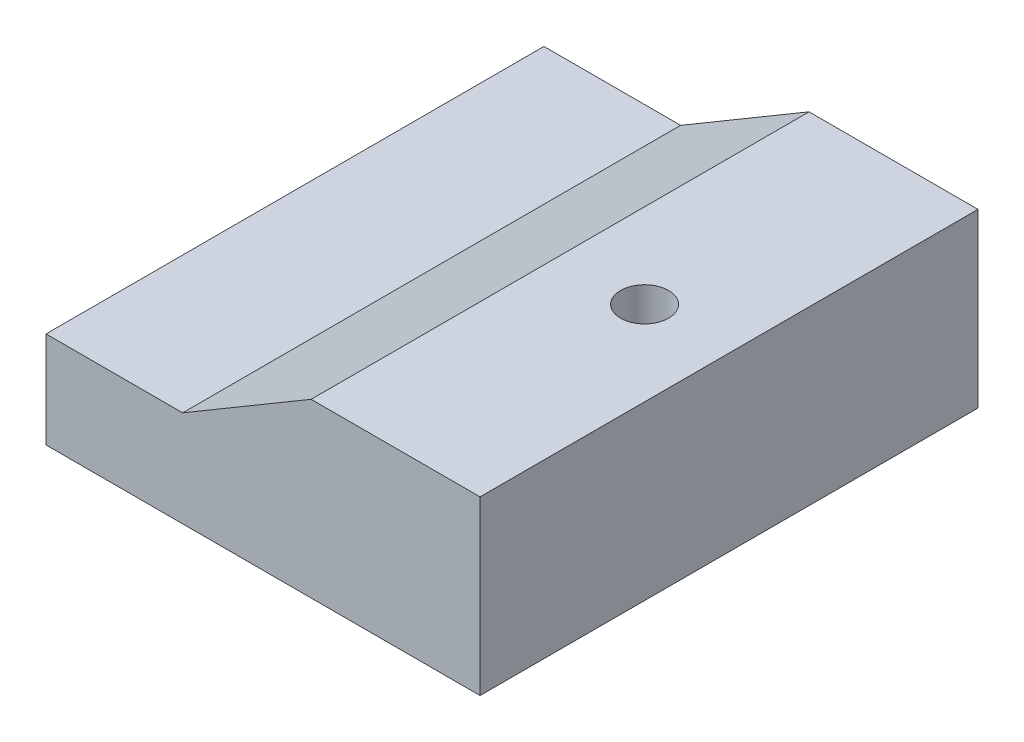
ISO-10303-21;
HEADER;
FILE_DESCRIPTION(('STEP AP214'),'2;1');
FILE_NAME('part.step','',(''),(''),'','','');
FILE_SCHEMA(('AUTOMOTIVE_DESIGN { 1 0 10303 214 1 1 1 1 }'));
ENDSEC;
DATA;
#1=APPLICATION_CONTEXT('core data for automotive mechanical design processes');
#2=APPLICATION_PROTOCOL_DEFINITION('international standard','automotive_design',2000,#1);
#3=PRODUCT_CONTEXT('',#1,'mechanical');
#4=PRODUCT('Part','Part','',(#3));
#5=PRODUCT_RELATED_PRODUCT_CATEGORY('part','',(#4));
#6=PRODUCT_DEFINITION_FORMATION('','',#4);
#7=PRODUCT_DEFINITION_CONTEXT('part definition',#1,'design');
#8=PRODUCT_DEFINITION('design','',#6,#7);
#9=PRODUCT_DEFINITION_SHAPE('','',#8);
#10=(LENGTH_UNIT() NAMED_UNIT(*) SI_UNIT(.MILLI.,.METRE.));
#11=(NAMED_UNIT(*) PLANE_ANGLE_UNIT() SI_UNIT($,.RADIAN.));
#12=(NAMED_UNIT(*) SI_UNIT($,.STERADIAN.) SOLID_ANGLE_UNIT());
#13=UNCERTAINTY_MEASURE_WITH_UNIT(LENGTH_MEASURE(1.E-05),#10,'distance_accuracy_value','');
#14=(GEOMETRIC_REPRESENTATION_CONTEXT(3) GLOBAL_UNCERTAINTY_ASSIGNED_CONTEXT((#13)) GLOBAL_UNIT_ASSIGNED_CONTEXT((#10,
#11,#12)) REPRESENTATION_CONTEXT('',''));
#15=CARTESIAN_POINT('',(0.,0.,0.));
#16=DIRECTION('',(0.,0.,1.));
#17=DIRECTION('',(1.,0.,0.));
#18=AXIS2_PLACEMENT_3D('',#15,#16,#17);
#19=CARTESIAN_POINT('',(1.52674382264479E-13,2720.,7870.));
#20=DIRECTION('',(-1.,0.,0.));
#21=DIRECTION('',(0.,-1.,0.));
#22=AXIS2_PLACEMENT_3D('',#19,#20,#21);
#23=PLANE('',#22);
#24=DIRECTION('',(0.,1.,0.));
#25=VECTOR('',#24,1.);
#26=CARTESIAN_POINT('',(1.52674382264479E-13,2720.,0.));
#27=LINE('',#26,#25);
#28=CARTESIAN_POINT('',(0.,0.,0.));
#29=VERTEX_POINT('',#28);
#30=CARTESIAN_POINT('',(1.52674382264479E-13,2720.,0.));
#31=VERTEX_POINT('',#30);
#32=EDGE_CURVE('E117',#29,#31,#27,.T.);
#33=ORIENTED_EDGE('',*,*,#32,.T.);
#34=DIRECTION('',(0.,0.,-1.));
#35=VECTOR('',#34,1.);
#36=CARTESIAN_POINT('',(1.52674382264479E-13,2720.,7870.));
#37=LINE('',#36,#35);
#38=CARTESIAN_POINT('',(1.52674382264479E-13,2720.,7870.));
#39=VERTEX_POINT('',#38);
#40=EDGE_CURVE('E11',#39,#31,#37,.T.);
#41=ORIENTED_EDGE('',*,*,#40,.F.);
#42=DIRECTION('',(0.,1.,0.));
#43=VECTOR('',#42,1.);
#44=CARTESIAN_POINT('',(1.52674382264479E-13,2720.,7870.));
#45=LINE('',#44,#43);
#46=CARTESIAN_POINT('',(0.,0.,7870.));
#47=VERTEX_POINT('',#46);
#48=EDGE_CURVE('E128',#47,#39,#45,.T.);
#49=ORIENTED_EDGE('',*,*,#48,.F.);
#50=DIRECTION('',(0.,0.,-1.));
#51=VECTOR('',#50,1.);
#52=CARTESIAN_POINT('',(0.,0.,7870.));
#53=LINE('',#52,#51);
#54=EDGE_CURVE('E113',#47,#29,#53,.T.);
#55=ORIENTED_EDGE('',*,*,#54,.T.);
#56=EDGE_LOOP('',(#33,#41,#49,#55));
#57=FACE_BOUND('',#56,.T.);
#58=ADVANCED_FACE('F33',(#57),#23,.F.);
#59=CARTESIAN_POINT('',(-2670.,2720.,7870.));
#60=DIRECTION('',(0.,-1.,0.));
#61=DIRECTION('',(0.,0.,-1.));
#62=AXIS2_PLACEMENT_3D('',#59,#60,#61);
#63=PLANE('',#62);
#64=CARTESIAN_POINT('',(-1335.,2720.,3935.));
#65=DIRECTION('',(0.,1.,0.));
#66=DIRECTION('',(0.,0.,1.));
#67=AXIS2_PLACEMENT_3D('',#64,#65,#66);
#68=CIRCLE('',#67,380.);
#69=CARTESIAN_POINT('',(-1335.,2720.,4315.));
#70=VERTEX_POINT('',#69);
#71=EDGE_CURVE('E214',#70,#70,#68,.T.);
#72=ORIENTED_EDGE('',*,*,#71,.F.);
#73=EDGE_LOOP('',(#72));
#74=FACE_BOUND('',#73,.T.);
#75=DIRECTION('',(-1.,0.,0.));
#76=VECTOR('',#75,1.);
#77=CARTESIAN_POINT('',(-2670.,2720.,0.));
#78=LINE('',#77,#76);
#79=CARTESIAN_POINT('',(-2670.,2720.,0.));
#80=VERTEX_POINT('',#79);
#81=EDGE_CURVE('E120',#31,#80,#78,.T.);
#82=ORIENTED_EDGE('',*,*,#81,.T.);
#83=DIRECTION('',(0.,0.,-1.));
#84=VECTOR('',#83,1.);
#85=CARTESIAN_POINT('',(-2670.,2720.,7870.));
#86=LINE('',#85,#84);
#87=CARTESIAN_POINT('',(-2670.,2720.,7870.));
#88=VERTEX_POINT('',#87);
#89=EDGE_CURVE('E41',#88,#80,#86,.T.);
#90=ORIENTED_EDGE('',*,*,#89,.F.);
#91=DIRECTION('',(-1.,0.,0.));
#92=VECTOR('',#91,1.);
#93=CARTESIAN_POINT('',(-2670.,2720.,7870.));
#94=LINE('',#93,#92);
#95=EDGE_CURVE('E86',#39,#88,#94,.T.);
#96=ORIENTED_EDGE('',*,*,#95,.F.);
#97=ORIENTED_EDGE('',*,*,#40,.T.);
#98=EDGE_LOOP('',(#82,#90,#96,#97));
#99=FACE_BOUND('',#98,.T.);
#100=ADVANCED_FACE('F154',(#74,#99),#63,.F.);
#101=CARTESIAN_POINT('',(-4700.,1520.,7870.));
#102=DIRECTION('',(0.508872173777017,-0.860842093972787,0.));
#103=DIRECTION('',(0.860842093972787,0.508872173777017,0.));
#104=AXIS2_PLACEMENT_3D('',#101,#102,#103);
#105=PLANE('',#104);
#106=DIRECTION('',(-0.860842093972787,-0.508872173777017,0.));
#107=VECTOR('',#106,1.);
#108=CARTESIAN_POINT('',(-4700.,1520.,0.));
#109=LINE('',#108,#107);
#110=CARTESIAN_POINT('',(-4700.,1520.,0.));
#111=VERTEX_POINT('',#110);
#112=EDGE_CURVE('E123',#80,#111,#109,.T.);
#113=ORIENTED_EDGE('',*,*,#112,.T.);
#114=DIRECTION('',(0.,0.,-1.));
#115=VECTOR('',#114,1.);
#116=CARTESIAN_POINT('',(-4700.,1520.,7870.));
#117=LINE('',#116,#115);
#118=CARTESIAN_POINT('',(-4700.,1520.,7870.));
#119=VERTEX_POINT('',#118);
#120=EDGE_CURVE('E108',#119,#111,#117,.T.);
#121=ORIENTED_EDGE('',*,*,#120,.F.);
#122=DIRECTION('',(-0.860842093972787,-0.508872173777017,0.));
#123=VECTOR('',#122,1.);
#124=CARTESIAN_POINT('',(-4700.,1520.,7870.));
#125=LINE('',#124,#123);
#126=EDGE_CURVE('E99',#88,#119,#125,.T.);
#127=ORIENTED_EDGE('',*,*,#126,.F.);
#128=ORIENTED_EDGE('',*,*,#89,.T.);
#129=EDGE_LOOP('',(#113,#121,#127,#128));
#130=FACE_BOUND('',#129,.T.);
#131=ADVANCED_FACE('F134',(#130),#105,.F.);
#132=CARTESIAN_POINT('',(-6860.,1520.00000000001,7870.));
#133=DIRECTION('',(0.,-1.,0.));
#134=DIRECTION('',(1.,0.,0.));
#135=AXIS2_PLACEMENT_3D('',#132,#133,#134);
#136=PLANE('',#135);
#137=DIRECTION('',(-1.,0.,0.));
#138=VECTOR('',#137,1.);
#139=CARTESIAN_POINT('',(-6860.,1520.00000000001,0.));
#140=LINE('',#139,#138);
#141=CARTESIAN_POINT('',(-6860.,1520.00000000001,0.));
#142=VERTEX_POINT('',#141);
#143=EDGE_CURVE('E107',#111,#142,#140,.T.);
#144=ORIENTED_EDGE('',*,*,#143,.T.);
#145=DIRECTION('',(0.,0.,-1.));
#146=VECTOR('',#145,1.);
#147=CARTESIAN_POINT('',(-6860.,1520.00000000001,7870.));
#148=LINE('',#147,#146);
#149=CARTESIAN_POINT('',(-6860.,1520.00000000001,7870.));
#150=VERTEX_POINT('',#149);
#151=EDGE_CURVE('E104',#150,#142,#148,.T.);
#152=ORIENTED_EDGE('',*,*,#151,.F.);
#153=DIRECTION('',(-1.,0.,0.));
#154=VECTOR('',#153,1.);
#155=CARTESIAN_POINT('',(-6860.,1520.00000000001,7870.));
#156=LINE('',#155,#154);
#157=EDGE_CURVE('E93',#119,#150,#156,.T.);
#158=ORIENTED_EDGE('',*,*,#157,.F.);
#159=ORIENTED_EDGE('',*,*,#120,.T.);
#160=EDGE_LOOP('',(#144,#152,#158,#159));
#161=FACE_BOUND('',#160,.T.);
#162=ADVANCED_FACE('F105',(#161),#136,.F.);
#163=CARTESIAN_POINT('',(-6860.,0.,7870.));
#164=DIRECTION('',(1.,0.,0.));
#165=DIRECTION('',(0.,1.,0.));
#166=AXIS2_PLACEMENT_3D('',#163,#164,#165);
#167=PLANE('',#166);
#168=DIRECTION('',(0.,-1.,0.));
#169=VECTOR('',#168,1.);
#170=CARTESIAN_POINT('',(-6860.,0.,0.));
#171=LINE('',#170,#169);
#172=CARTESIAN_POINT('',(-6860.,0.,0.));
#173=VERTEX_POINT('',#172);
#174=EDGE_CURVE('E72',#142,#173,#171,.T.);
#175=ORIENTED_EDGE('',*,*,#174,.T.);
#176=DIRECTION('',(0.,0.,-1.));
#177=VECTOR('',#176,1.);
#178=CARTESIAN_POINT('',(-6860.,0.,7870.));
#179=LINE('',#178,#177);
#180=CARTESIAN_POINT('',(-6860.,0.,7870.));
#181=VERTEX_POINT('',#180);
#182=EDGE_CURVE('E109',#181,#173,#179,.T.);
#183=ORIENTED_EDGE('',*,*,#182,.F.);
#184=DIRECTION('',(0.,-1.,0.));
#185=VECTOR('',#184,1.);
#186=CARTESIAN_POINT('',(-6860.,0.,7870.));
#187=LINE('',#186,#185);
#188=EDGE_CURVE('E97',#150,#181,#187,.T.);
#189=ORIENTED_EDGE('',*,*,#188,.F.);
#190=ORIENTED_EDGE('',*,*,#151,.T.);
#191=EDGE_LOOP('',(#175,#183,#189,#190));
#192=FACE_BOUND('',#191,.T.);
#193=ADVANCED_FACE('F111',(#192),#167,.F.);
#194=CARTESIAN_POINT('',(0.,0.,7870.));
#195=DIRECTION('',(0.,1.,0.));
#196=DIRECTION('',(0.,0.,1.));
#197=AXIS2_PLACEMENT_3D('',#194,#195,#196);
#198=PLANE('',#197);
#199=CARTESIAN_POINT('',(-1335.,0.,3935.));
#200=DIRECTION('',(0.,1.,0.));
#201=DIRECTION('',(0.,0.,1.));
#202=AXIS2_PLACEMENT_3D('',#199,#200,#201);
#203=CIRCLE('',#202,380.);
#204=CARTESIAN_POINT('',(-1335.,0.,4315.));
#205=VERTEX_POINT('',#204);
#206=EDGE_CURVE('E121',#205,#205,#203,.T.);
#207=ORIENTED_EDGE('',*,*,#206,.T.);
#208=EDGE_LOOP('',(#207));
#209=FACE_BOUND('',#208,.T.);
#210=DIRECTION('',(1.,0.,0.));
#211=VECTOR('',#210,1.);
#212=CARTESIAN_POINT('',(0.,0.,0.));
#213=LINE('',#212,#211);
#214=EDGE_CURVE('E78',#173,#29,#213,.T.);
#215=ORIENTED_EDGE('',*,*,#214,.T.);
#216=ORIENTED_EDGE('',*,*,#54,.F.);
#217=DIRECTION('',(1.,0.,0.));
#218=VECTOR('',#217,1.);
#219=CARTESIAN_POINT('',(0.,0.,7870.));
#220=LINE('',#219,#218);
#221=EDGE_CURVE('E49',#181,#47,#220,.T.);
#222=ORIENTED_EDGE('',*,*,#221,.F.);
#223=ORIENTED_EDGE('',*,*,#182,.T.);
#224=EDGE_LOOP('',(#215,#216,#222,#223));
#225=FACE_BOUND('',#224,.T.);
#226=ADVANCED_FACE('F141',(#209,#225),#198,.F.);
#227=CARTESIAN_POINT('',(0.,0.,7870.));
#228=DIRECTION('',(0.,0.,-1.));
#229=DIRECTION('',(-1.,0.,0.));
#230=AXIS2_PLACEMENT_3D('',#227,#228,#229);
#231=PLANE('',#230);
#232=ORIENTED_EDGE('',*,*,#48,.T.);
#233=ORIENTED_EDGE('',*,*,#95,.T.);
#234=ORIENTED_EDGE('',*,*,#126,.T.);
#235=ORIENTED_EDGE('',*,*,#157,.T.);
#236=ORIENTED_EDGE('',*,*,#188,.T.);
#237=ORIENTED_EDGE('',*,*,#221,.T.);
#238=EDGE_LOOP('',(#232,#233,#234,#235,#236,#237));
#239=FACE_BOUND('',#238,.T.);
#240=ADVANCED_FACE('F95',(#239),#231,.F.);
#241=CARTESIAN_POINT('',(0.,0.,0.));
#242=DIRECTION('',(0.,0.,-1.));
#243=DIRECTION('',(-1.,0.,0.));
#244=AXIS2_PLACEMENT_3D('',#241,#242,#243);
#245=PLANE('',#244);
#246=ORIENTED_EDGE('',*,*,#32,.F.);
#247=ORIENTED_EDGE('',*,*,#214,.F.);
#248=ORIENTED_EDGE('',*,*,#174,.F.);
#249=ORIENTED_EDGE('',*,*,#143,.F.);
#250=ORIENTED_EDGE('',*,*,#112,.F.);
#251=ORIENTED_EDGE('',*,*,#81,.F.);
#252=EDGE_LOOP('',(#246,#247,#248,#249,#250,#251));
#253=FACE_BOUND('',#252,.T.);
#254=ADVANCED_FACE('F137',(#253),#245,.T.);
#255=CARTESIAN_POINT('',(-1335.,0.,3935.));
#256=DIRECTION('',(0.,1.,0.));
#257=DIRECTION('',(0.,0.,1.));
#258=AXIS2_PLACEMENT_3D('',#255,#256,#257);
#259=CYLINDRICAL_SURFACE('',#258,380.);
#260=ORIENTED_EDGE('',*,*,#206,.F.);
#261=EDGE_LOOP('',(#260));
#262=FACE_BOUND('',#261,.T.);
#263=ORIENTED_EDGE('',*,*,#71,.T.);
#264=EDGE_LOOP('',(#263));
#265=FACE_BOUND('',#264,.T.);
#266=ADVANCED_FACE('F189',(#262,#265),#259,.F.);
#267=CLOSED_SHELL('',(#58,#100,#131,#162,#193,#226,#240,#254,#266));
#268=MANIFOLD_SOLID_BREP('B2',#267);
#269=ADVANCED_BREP_SHAPE_REPRESENTATION('',(#18,#268),#14);
#270=SHAPE_DEFINITION_REPRESENTATION(#9,#269);
ENDSEC;
END-ISO-10303-21;
